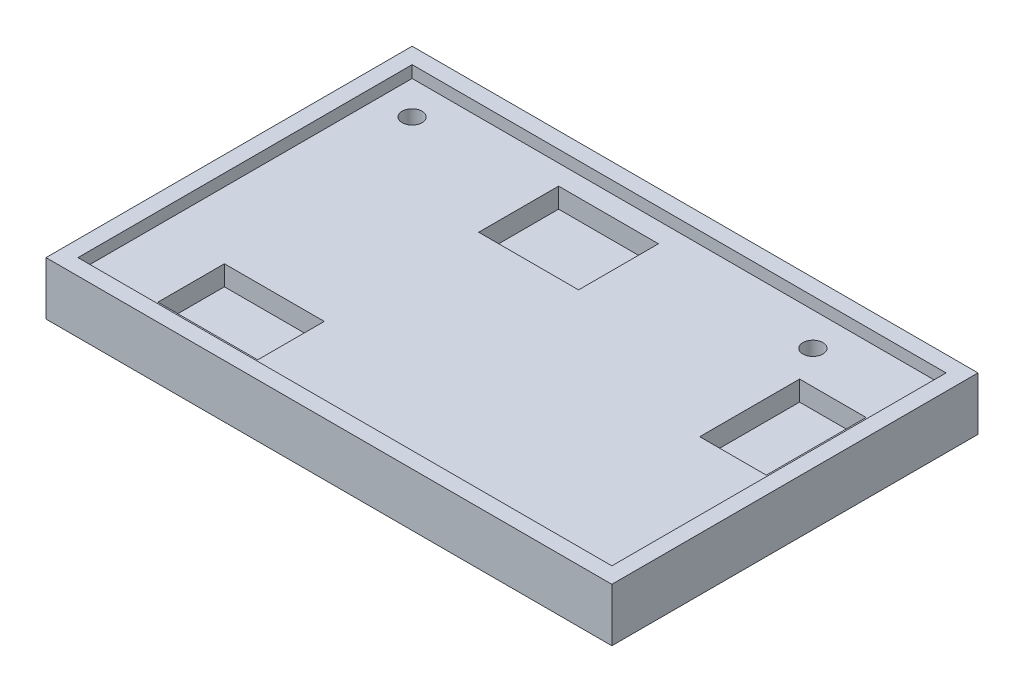
ISO-10303-21;
HEADER;
FILE_DESCRIPTION(('STEP AP214'),'2;1');
FILE_NAME('part.step','',(''),(''),'','','');
FILE_SCHEMA(('AUTOMOTIVE_DESIGN { 1 0 10303 214 1 1 1 1 }'));
ENDSEC;
DATA;
#1=APPLICATION_CONTEXT('core data for automotive mechanical design processes');
#2=APPLICATION_PROTOCOL_DEFINITION('international standard','automotive_design',2000,#1);
#3=PRODUCT_CONTEXT('',#1,'mechanical');
#4=PRODUCT('Part','Part','',(#3));
#5=PRODUCT_RELATED_PRODUCT_CATEGORY('part','',(#4));
#6=PRODUCT_DEFINITION_FORMATION('','',#4);
#7=PRODUCT_DEFINITION_CONTEXT('part definition',#1,'design');
#8=PRODUCT_DEFINITION('design','',#6,#7);
#9=PRODUCT_DEFINITION_SHAPE('','',#8);
#10=(LENGTH_UNIT() NAMED_UNIT(*) SI_UNIT(.MILLI.,.METRE.));
#11=(NAMED_UNIT(*) PLANE_ANGLE_UNIT() SI_UNIT($,.RADIAN.));
#12=(NAMED_UNIT(*) SI_UNIT($,.STERADIAN.) SOLID_ANGLE_UNIT());
#13=UNCERTAINTY_MEASURE_WITH_UNIT(LENGTH_MEASURE(1.E-05),#10,'distance_accuracy_value','');
#14=(GEOMETRIC_REPRESENTATION_CONTEXT(3) GLOBAL_UNCERTAINTY_ASSIGNED_CONTEXT((#13)) GLOBAL_UNIT_ASSIGNED_CONTEXT((#10,
#11,#12)) REPRESENTATION_CONTEXT('',''));
#15=CARTESIAN_POINT('',(0.,0.,0.));
#16=DIRECTION('',(0.,0.,1.));
#17=DIRECTION('',(1.,0.,0.));
#18=AXIS2_PLACEMENT_3D('',#15,#16,#17);
#19=CARTESIAN_POINT('',(0.,8.,-55.));
#20=DIRECTION('',(0.,0.,-1.));
#21=DIRECTION('',(-1.,0.,0.));
#22=AXIS2_PLACEMENT_3D('',#19,#20,#21);
#23=PLANE('',#22);
#24=DIRECTION('',(1.,0.,0.));
#25=VECTOR('',#24,1.);
#26=CARTESIAN_POINT('',(0.,0.,-55.));
#27=LINE('',#26,#25);
#28=CARTESIAN_POINT('',(0.,0.,-55.));
#29=VERTEX_POINT('',#28);
#30=CARTESIAN_POINT('',(85.,0.,-55.));
#31=VERTEX_POINT('',#30);
#32=EDGE_CURVE('E316',#29,#31,#27,.T.);
#33=ORIENTED_EDGE('',*,*,#32,.F.);
#34=DIRECTION('',(0.,-1.,0.));
#35=VECTOR('',#34,1.);
#36=CARTESIAN_POINT('',(0.,8.,-55.));
#37=LINE('',#36,#35);
#38=CARTESIAN_POINT('',(0.,8.,-55.));
#39=VERTEX_POINT('',#38);
#40=EDGE_CURVE('E11',#39,#29,#37,.T.);
#41=ORIENTED_EDGE('',*,*,#40,.F.);
#42=DIRECTION('',(1.,0.,0.));
#43=VECTOR('',#42,1.);
#44=CARTESIAN_POINT('',(0.,8.,-55.));
#45=LINE('',#44,#43);
#46=CARTESIAN_POINT('',(85.,8.,-55.));
#47=VERTEX_POINT('',#46);
#48=EDGE_CURVE('E323',#39,#47,#45,.T.);
#49=ORIENTED_EDGE('',*,*,#48,.T.);
#50=DIRECTION('',(0.,-1.,0.));
#51=VECTOR('',#50,1.);
#52=CARTESIAN_POINT('',(85.,8.,-55.));
#53=LINE('',#52,#51);
#54=EDGE_CURVE('E44',#47,#31,#53,.T.);
#55=ORIENTED_EDGE('',*,*,#54,.T.);
#56=EDGE_LOOP('',(#33,#41,#49,#55));
#57=FACE_BOUND('',#56,.T.);
#58=ADVANCED_FACE('F41',(#57),#23,.T.);
#59=CARTESIAN_POINT('',(0.,8.,0.));
#60=DIRECTION('',(-1.,0.,0.));
#61=DIRECTION('',(0.,0.,1.));
#62=AXIS2_PLACEMENT_3D('',#59,#60,#61);
#63=PLANE('',#62);
#64=DIRECTION('',(0.,0.,-1.));
#65=VECTOR('',#64,1.);
#66=CARTESIAN_POINT('',(0.,0.,0.));
#67=LINE('',#66,#65);
#68=CARTESIAN_POINT('',(0.,0.,0.));
#69=VERTEX_POINT('',#68);
#70=EDGE_CURVE('E327',#69,#29,#67,.T.);
#71=ORIENTED_EDGE('',*,*,#70,.F.);
#72=DIRECTION('',(0.,-1.,0.));
#73=VECTOR('',#72,1.);
#74=CARTESIAN_POINT('',(0.,8.,0.));
#75=LINE('',#74,#73);
#76=CARTESIAN_POINT('',(0.,8.,0.));
#77=VERTEX_POINT('',#76);
#78=EDGE_CURVE('E49',#77,#69,#75,.T.);
#79=ORIENTED_EDGE('',*,*,#78,.F.);
#80=DIRECTION('',(0.,0.,-1.));
#81=VECTOR('',#80,1.);
#82=CARTESIAN_POINT('',(0.,8.,0.));
#83=LINE('',#82,#81);
#84=EDGE_CURVE('E331',#77,#39,#83,.T.);
#85=ORIENTED_EDGE('',*,*,#84,.T.);
#86=ORIENTED_EDGE('',*,*,#40,.T.);
#87=EDGE_LOOP('',(#71,#79,#85,#86));
#88=FACE_BOUND('',#87,.T.);
#89=ADVANCED_FACE('F359',(#88),#63,.T.);
#90=CARTESIAN_POINT('',(0.,8.,0.));
#91=DIRECTION('',(0.,0.,-1.));
#92=DIRECTION('',(-1.,0.,0.));
#93=AXIS2_PLACEMENT_3D('',#90,#91,#92);
#94=PLANE('',#93);
#95=DIRECTION('',(1.,0.,0.));
#96=VECTOR('',#95,1.);
#97=CARTESIAN_POINT('',(0.,0.,0.));
#98=LINE('',#97,#96);
#99=CARTESIAN_POINT('',(85.,0.,0.));
#100=VERTEX_POINT('',#99);
#101=EDGE_CURVE('E339',#69,#100,#98,.T.);
#102=ORIENTED_EDGE('',*,*,#101,.T.);
#103=DIRECTION('',(0.,-1.,0.));
#104=VECTOR('',#103,1.);
#105=CARTESIAN_POINT('',(85.,8.,0.));
#106=LINE('',#105,#104);
#107=CARTESIAN_POINT('',(85.,8.,0.));
#108=VERTEX_POINT('',#107);
#109=EDGE_CURVE('E343',#108,#100,#106,.T.);
#110=ORIENTED_EDGE('',*,*,#109,.F.);
#111=DIRECTION('',(1.,0.,0.));
#112=VECTOR('',#111,1.);
#113=CARTESIAN_POINT('',(0.,8.,0.));
#114=LINE('',#113,#112);
#115=EDGE_CURVE('E329',#77,#108,#114,.T.);
#116=ORIENTED_EDGE('',*,*,#115,.F.);
#117=ORIENTED_EDGE('',*,*,#78,.T.);
#118=EDGE_LOOP('',(#102,#110,#116,#117));
#119=FACE_BOUND('',#118,.T.);
#120=ADVANCED_FACE('F365',(#119),#94,.F.);
#121=CARTESIAN_POINT('',(85.,8.,0.));
#122=DIRECTION('',(-1.,0.,0.));
#123=DIRECTION('',(0.,0.,1.));
#124=AXIS2_PLACEMENT_3D('',#121,#122,#123);
#125=PLANE('',#124);
#126=DIRECTION('',(0.,0.,-1.));
#127=VECTOR('',#126,1.);
#128=CARTESIAN_POINT('',(85.,0.,0.));
#129=LINE('',#128,#127);
#130=EDGE_CURVE('E336',#100,#31,#129,.T.);
#131=ORIENTED_EDGE('',*,*,#130,.T.);
#132=ORIENTED_EDGE('',*,*,#54,.F.);
#133=DIRECTION('',(0.,0.,-1.));
#134=VECTOR('',#133,1.);
#135=CARTESIAN_POINT('',(85.,8.,0.));
#136=LINE('',#135,#134);
#137=EDGE_CURVE('E326',#108,#47,#136,.T.);
#138=ORIENTED_EDGE('',*,*,#137,.F.);
#139=ORIENTED_EDGE('',*,*,#109,.T.);
#140=EDGE_LOOP('',(#131,#132,#138,#139));
#141=FACE_BOUND('',#140,.T.);
#142=ADVANCED_FACE('F353',(#141),#125,.F.);
#143=CARTESIAN_POINT('',(0.,8.,0.));
#144=DIRECTION('',(0.,1.,0.));
#145=DIRECTION('',(0.,0.,1.));
#146=AXIS2_PLACEMENT_3D('',#143,#144,#145);
#147=PLANE('',#146);
#148=DIRECTION('',(0.,0.,1.));
#149=VECTOR('',#148,1.);
#150=CARTESIAN_POINT('',(2.4,8.,-52.6));
#151=LINE('',#150,#149);
#152=CARTESIAN_POINT('',(2.4,8.,-52.6));
#153=VERTEX_POINT('',#152);
#154=CARTESIAN_POINT('',(2.4,8.,-2.4));
#155=VERTEX_POINT('',#154);
#156=EDGE_CURVE('E288',#153,#155,#151,.T.);
#157=ORIENTED_EDGE('',*,*,#156,.F.);
#158=DIRECTION('',(-1.,0.,0.));
#159=VECTOR('',#158,1.);
#160=CARTESIAN_POINT('',(82.6,8.,-52.6));
#161=LINE('',#160,#159);
#162=CARTESIAN_POINT('',(82.6,8.,-52.6));
#163=VERTEX_POINT('',#162);
#164=EDGE_CURVE('E295',#163,#153,#161,.T.);
#165=ORIENTED_EDGE('',*,*,#164,.F.);
#166=DIRECTION('',(0.,0.,-1.));
#167=VECTOR('',#166,1.);
#168=CARTESIAN_POINT('',(82.6,8.,-2.4));
#169=LINE('',#168,#167);
#170=CARTESIAN_POINT('',(82.6,8.,-2.4));
#171=VERTEX_POINT('',#170);
#172=EDGE_CURVE('E309',#171,#163,#169,.T.);
#173=ORIENTED_EDGE('',*,*,#172,.F.);
#174=DIRECTION('',(1.,0.,0.));
#175=VECTOR('',#174,1.);
#176=CARTESIAN_POINT('',(2.4,8.,-2.4));
#177=LINE('',#176,#175);
#178=EDGE_CURVE('E306',#155,#171,#177,.T.);
#179=ORIENTED_EDGE('',*,*,#178,.F.);
#180=EDGE_LOOP('',(#157,#165,#173,#179));
#181=FACE_BOUND('',#180,.T.);
#182=ORIENTED_EDGE('',*,*,#48,.F.);
#183=ORIENTED_EDGE('',*,*,#84,.F.);
#184=ORIENTED_EDGE('',*,*,#115,.T.);
#185=ORIENTED_EDGE('',*,*,#137,.T.);
#186=EDGE_LOOP('',(#182,#183,#184,#185));
#187=FACE_BOUND('',#186,.T.);
#188=ADVANCED_FACE('F363',(#181,#187),#147,.T.);
#189=CARTESIAN_POINT('',(0.,0.,0.));
#190=DIRECTION('',(0.,1.,0.));
#191=DIRECTION('',(0.,0.,1.));
#192=AXIS2_PLACEMENT_3D('',#189,#190,#191);
#193=PLANE('',#192);
#194=ORIENTED_EDGE('',*,*,#32,.T.);
#195=ORIENTED_EDGE('',*,*,#130,.F.);
#196=ORIENTED_EDGE('',*,*,#101,.F.);
#197=ORIENTED_EDGE('',*,*,#70,.T.);
#198=EDGE_LOOP('',(#194,#195,#196,#197));
#199=FACE_BOUND('',#198,.T.);
#200=ADVANCED_FACE('F356',(#199),#193,.F.);
#201=CARTESIAN_POINT('',(2.4,6.2,-52.6));
#202=DIRECTION('',(-1.,0.,0.));
#203=DIRECTION('',(0.,0.,1.));
#204=AXIS2_PLACEMENT_3D('',#201,#202,#203);
#205=PLANE('',#204);
#206=ORIENTED_EDGE('',*,*,#156,.T.);
#207=DIRECTION('',(0.,1.,0.));
#208=VECTOR('',#207,1.);
#209=CARTESIAN_POINT('',(2.4,6.2,-2.4));
#210=LINE('',#209,#208);
#211=CARTESIAN_POINT('',(2.4,6.2,-2.4));
#212=VERTEX_POINT('',#211);
#213=EDGE_CURVE('E304',#212,#155,#210,.T.);
#214=ORIENTED_EDGE('',*,*,#213,.F.);
#215=DIRECTION('',(0.,0.,1.));
#216=VECTOR('',#215,1.);
#217=CARTESIAN_POINT('',(2.4,6.2,-52.6));
#218=LINE('',#217,#216);
#219=CARTESIAN_POINT('',(2.4,6.2,-52.6));
#220=VERTEX_POINT('',#219);
#221=EDGE_CURVE('E291',#220,#212,#218,.T.);
#222=ORIENTED_EDGE('',*,*,#221,.F.);
#223=DIRECTION('',(0.,1.,0.));
#224=VECTOR('',#223,1.);
#225=CARTESIAN_POINT('',(2.4,6.2,-52.6));
#226=LINE('',#225,#224);
#227=EDGE_CURVE('E314',#220,#153,#226,.T.);
#228=ORIENTED_EDGE('',*,*,#227,.T.);
#229=EDGE_LOOP('',(#206,#214,#222,#228));
#230=FACE_BOUND('',#229,.T.);
#231=ADVANCED_FACE('F411',(#230),#205,.F.);
#232=CARTESIAN_POINT('',(82.6,6.2,-52.6));
#233=DIRECTION('',(0.,0.,-1.));
#234=DIRECTION('',(-1.,0.,0.));
#235=AXIS2_PLACEMENT_3D('',#232,#233,#234);
#236=PLANE('',#235);
#237=ORIENTED_EDGE('',*,*,#164,.T.);
#238=ORIENTED_EDGE('',*,*,#227,.F.);
#239=DIRECTION('',(-1.,0.,0.));
#240=VECTOR('',#239,1.);
#241=CARTESIAN_POINT('',(82.6,6.2,-52.6));
#242=LINE('',#241,#240);
#243=CARTESIAN_POINT('',(82.6,6.2,-52.6));
#244=VERTEX_POINT('',#243);
#245=EDGE_CURVE('E301',#244,#220,#242,.T.);
#246=ORIENTED_EDGE('',*,*,#245,.F.);
#247=DIRECTION('',(0.,1.,0.));
#248=VECTOR('',#247,1.);
#249=CARTESIAN_POINT('',(82.6,6.2,-52.6));
#250=LINE('',#249,#248);
#251=EDGE_CURVE('E317',#244,#163,#250,.T.);
#252=ORIENTED_EDGE('',*,*,#251,.T.);
#253=EDGE_LOOP('',(#237,#238,#246,#252));
#254=FACE_BOUND('',#253,.T.);
#255=ADVANCED_FACE('F419',(#254),#236,.F.);
#256=CARTESIAN_POINT('',(82.6,6.2,-2.4));
#257=DIRECTION('',(1.,0.,0.));
#258=DIRECTION('',(0.,0.,-1.));
#259=AXIS2_PLACEMENT_3D('',#256,#257,#258);
#260=PLANE('',#259);
#261=ORIENTED_EDGE('',*,*,#172,.T.);
#262=ORIENTED_EDGE('',*,*,#251,.F.);
#263=DIRECTION('',(0.,0.,-1.));
#264=VECTOR('',#263,1.);
#265=CARTESIAN_POINT('',(82.6,6.2,-2.4));
#266=LINE('',#265,#264);
#267=CARTESIAN_POINT('',(82.6,6.2,-2.4));
#268=VERTEX_POINT('',#267);
#269=EDGE_CURVE('E298',#268,#244,#266,.T.);
#270=ORIENTED_EDGE('',*,*,#269,.F.);
#271=DIRECTION('',(0.,1.,0.));
#272=VECTOR('',#271,1.);
#273=CARTESIAN_POINT('',(82.6,6.2,-2.4));
#274=LINE('',#273,#272);
#275=EDGE_CURVE('E319',#268,#171,#274,.T.);
#276=ORIENTED_EDGE('',*,*,#275,.T.);
#277=EDGE_LOOP('',(#261,#262,#270,#276));
#278=FACE_BOUND('',#277,.T.);
#279=ADVANCED_FACE('F429',(#278),#260,.F.);
#280=CARTESIAN_POINT('',(2.4,6.2,-2.4));
#281=DIRECTION('',(0.,0.,1.));
#282=DIRECTION('',(1.,0.,0.));
#283=AXIS2_PLACEMENT_3D('',#280,#281,#282);
#284=PLANE('',#283);
#285=ORIENTED_EDGE('',*,*,#178,.T.);
#286=ORIENTED_EDGE('',*,*,#275,.F.);
#287=DIRECTION('',(1.,0.,0.));
#288=VECTOR('',#287,1.);
#289=CARTESIAN_POINT('',(2.4,6.2,-2.4));
#290=LINE('',#289,#288);
#291=EDGE_CURVE('E294',#212,#268,#290,.T.);
#292=ORIENTED_EDGE('',*,*,#291,.F.);
#293=ORIENTED_EDGE('',*,*,#213,.T.);
#294=EDGE_LOOP('',(#285,#286,#292,#293));
#295=FACE_BOUND('',#294,.T.);
#296=ADVANCED_FACE('F439',(#295),#284,.F.);
#297=CARTESIAN_POINT('',(0.,6.2,0.));
#298=DIRECTION('',(0.,1.,0.));
#299=DIRECTION('',(0.,0.,1.));
#300=AXIS2_PLACEMENT_3D('',#297,#298,#299);
#301=PLANE('',#300);
#302=DIRECTION('',(0.,0.,1.));
#303=VECTOR('',#302,1.);
#304=CARTESIAN_POINT('',(12.4,6.2,-14.4));
#305=LINE('',#304,#303);
#306=CARTESIAN_POINT('',(12.4,6.2,-14.4));
#307=VERTEX_POINT('',#306);
#308=CARTESIAN_POINT('',(12.4,6.2,-4.4));
#309=VERTEX_POINT('',#308);
#310=EDGE_CURVE('E57',#307,#309,#305,.T.);
#311=ORIENTED_EDGE('',*,*,#310,.F.);
#312=DIRECTION('',(-1.,0.,0.));
#313=VECTOR('',#312,1.);
#314=CARTESIAN_POINT('',(12.4,6.2,-14.4));
#315=LINE('',#314,#313);
#316=CARTESIAN_POINT('',(27.4,6.2,-14.4));
#317=VERTEX_POINT('',#316);
#318=EDGE_CURVE('E198',#317,#307,#315,.T.);
#319=ORIENTED_EDGE('',*,*,#318,.F.);
#320=DIRECTION('',(0.,0.,-1.));
#321=VECTOR('',#320,1.);
#322=CARTESIAN_POINT('',(27.4,6.2,-14.4));
#323=LINE('',#322,#321);
#324=CARTESIAN_POINT('',(27.4,6.2,-4.4));
#325=VERTEX_POINT('',#324);
#326=EDGE_CURVE('E201',#325,#317,#323,.T.);
#327=ORIENTED_EDGE('',*,*,#326,.F.);
#328=DIRECTION('',(1.,0.,0.));
#329=VECTOR('',#328,1.);
#330=CARTESIAN_POINT('',(12.4,6.2,-4.4));
#331=LINE('',#330,#329);
#332=EDGE_CURVE('E207',#309,#325,#331,.T.);
#333=ORIENTED_EDGE('',*,*,#332,.F.);
#334=EDGE_LOOP('',(#311,#319,#327,#333));
#335=FACE_BOUND('',#334,.T.);
#336=DIRECTION('',(0.,0.,1.));
#337=VECTOR('',#336,1.);
#338=CARTESIAN_POINT('',(70.6,6.2,-42.6));
#339=LINE('',#338,#337);
#340=CARTESIAN_POINT('',(70.6,6.2,-42.6));
#341=VERTEX_POINT('',#340);
#342=CARTESIAN_POINT('',(70.6,6.2,-27.6));
#343=VERTEX_POINT('',#342);
#344=EDGE_CURVE('E65',#341,#343,#339,.T.);
#345=ORIENTED_EDGE('',*,*,#344,.F.);
#346=DIRECTION('',(-1.,0.,0.));
#347=VECTOR('',#346,1.);
#348=CARTESIAN_POINT('',(70.6,6.2,-42.6));
#349=LINE('',#348,#347);
#350=CARTESIAN_POINT('',(80.6,6.2,-42.6));
#351=VERTEX_POINT('',#350);
#352=EDGE_CURVE('E227',#351,#341,#349,.T.);
#353=ORIENTED_EDGE('',*,*,#352,.F.);
#354=DIRECTION('',(0.,0.,-1.));
#355=VECTOR('',#354,1.);
#356=CARTESIAN_POINT('',(80.6,6.2,-42.6));
#357=LINE('',#356,#355);
#358=CARTESIAN_POINT('',(80.6,6.2,-27.6));
#359=VERTEX_POINT('',#358);
#360=EDGE_CURVE('E230',#359,#351,#357,.T.);
#361=ORIENTED_EDGE('',*,*,#360,.F.);
#362=DIRECTION('',(1.,0.,0.));
#363=VECTOR('',#362,1.);
#364=CARTESIAN_POINT('',(70.6,6.2,-27.6));
#365=LINE('',#364,#363);
#366=EDGE_CURVE('E234',#343,#359,#365,.T.);
#367=ORIENTED_EDGE('',*,*,#366,.F.);
#368=EDGE_LOOP('',(#345,#353,#361,#367));
#369=FACE_BOUND('',#368,.T.);
#370=DIRECTION('',(0.,0.,1.));
#371=VECTOR('',#370,1.);
#372=CARTESIAN_POINT('',(27.4,6.2,-49.6));
#373=LINE('',#372,#371);
#374=CARTESIAN_POINT('',(27.4,6.2,-49.6));
#375=VERTEX_POINT('',#374);
#376=CARTESIAN_POINT('',(27.4,6.2,-37.6));
#377=VERTEX_POINT('',#376);
#378=EDGE_CURVE('E226',#375,#377,#373,.T.);
#379=ORIENTED_EDGE('',*,*,#378,.F.);
#380=DIRECTION('',(-1.,0.,0.));
#381=VECTOR('',#380,1.);
#382=CARTESIAN_POINT('',(27.4,6.2,-49.6));
#383=LINE('',#382,#381);
#384=CARTESIAN_POINT('',(42.4,6.2,-49.6));
#385=VERTEX_POINT('',#384);
#386=EDGE_CURVE('E258',#385,#375,#383,.T.);
#387=ORIENTED_EDGE('',*,*,#386,.F.);
#388=DIRECTION('',(0.,0.,-1.));
#389=VECTOR('',#388,1.);
#390=CARTESIAN_POINT('',(42.4,6.2,-49.6));
#391=LINE('',#390,#389);
#392=CARTESIAN_POINT('',(42.4,6.2,-37.6));
#393=VERTEX_POINT('',#392);
#394=EDGE_CURVE('E261',#393,#385,#391,.T.);
#395=ORIENTED_EDGE('',*,*,#394,.F.);
#396=DIRECTION('',(1.,0.,0.));
#397=VECTOR('',#396,1.);
#398=CARTESIAN_POINT('',(27.4,6.2,-37.6));
#399=LINE('',#398,#397);
#400=EDGE_CURVE('E265',#377,#393,#399,.T.);
#401=ORIENTED_EDGE('',*,*,#400,.F.);
#402=EDGE_LOOP('',(#379,#387,#395,#401));
#403=FACE_BOUND('',#402,.T.);
#404=CARTESIAN_POINT('',(67.6,6.2,-47.6));
#405=DIRECTION('',(0.,1.,0.));
#406=DIRECTION('',(0.,0.,-1.));
#407=AXIS2_PLACEMENT_3D('',#404,#405,#406);
#408=CIRCLE('',#407,1.50000000000001);
#409=CARTESIAN_POINT('',(67.6,6.2,-49.1));
#410=VERTEX_POINT('',#409);
#411=EDGE_CURVE('E279',#410,#410,#408,.T.);
#412=ORIENTED_EDGE('',*,*,#411,.F.);
#413=EDGE_LOOP('',(#412));
#414=FACE_BOUND('',#413,.T.);
#415=CARTESIAN_POINT('',(7.4,6.2,-47.6));
#416=DIRECTION('',(0.,1.,0.));
#417=DIRECTION('',(0.,0.,1.));
#418=AXIS2_PLACEMENT_3D('',#415,#416,#417);
#419=CIRCLE('',#418,1.5);
#420=CARTESIAN_POINT('',(7.4,6.2,-46.1));
#421=VERTEX_POINT('',#420);
#422=EDGE_CURVE('E282',#421,#421,#419,.T.);
#423=ORIENTED_EDGE('',*,*,#422,.F.);
#424=EDGE_LOOP('',(#423));
#425=FACE_BOUND('',#424,.T.);
#426=ORIENTED_EDGE('',*,*,#221,.T.);
#427=ORIENTED_EDGE('',*,*,#291,.T.);
#428=ORIENTED_EDGE('',*,*,#269,.T.);
#429=ORIENTED_EDGE('',*,*,#245,.T.);
#430=EDGE_LOOP('',(#426,#427,#428,#429));
#431=FACE_BOUND('',#430,.T.);
#432=ADVANCED_FACE('F449',(#335,#369,#403,#414,#425,#431),#301,.T.);
#433=CARTESIAN_POINT('',(7.4,4.,-47.6));
#434=DIRECTION('',(0.,1.,0.));
#435=DIRECTION('',(0.,0.,1.));
#436=AXIS2_PLACEMENT_3D('',#433,#434,#435);
#437=CYLINDRICAL_SURFACE('',#436,1.5);
#438=CARTESIAN_POINT('',(7.4,4.,-47.6));
#439=DIRECTION('',(0.,1.,0.));
#440=DIRECTION('',(0.,0.,1.));
#441=AXIS2_PLACEMENT_3D('',#438,#439,#440);
#442=CIRCLE('',#441,1.5);
#443=CARTESIAN_POINT('',(7.4,4.,-46.1));
#444=VERTEX_POINT('',#443);
#445=EDGE_CURVE('E285',#444,#444,#442,.T.);
#446=ORIENTED_EDGE('',*,*,#445,.F.);
#447=EDGE_LOOP('',(#446));
#448=FACE_BOUND('',#447,.T.);
#449=ORIENTED_EDGE('',*,*,#422,.T.);
#450=EDGE_LOOP('',(#449));
#451=FACE_BOUND('',#450,.T.);
#452=ADVANCED_FACE('F460',(#448,#451),#437,.F.);
#453=CARTESIAN_POINT('',(7.4,4.,-47.6));
#454=DIRECTION('',(0.,1.,0.));
#455=DIRECTION('',(0.,0.,1.));
#456=AXIS2_PLACEMENT_3D('',#453,#454,#455);
#457=PLANE('',#456);
#458=ORIENTED_EDGE('',*,*,#445,.T.);
#459=EDGE_LOOP('',(#458));
#460=FACE_BOUND('',#459,.T.);
#461=ADVANCED_FACE('F471',(#460),#457,.T.);
#462=CARTESIAN_POINT('',(67.6,4.,-47.6));
#463=DIRECTION('',(0.,1.,0.));
#464=DIRECTION('',(0.,0.,1.));
#465=AXIS2_PLACEMENT_3D('',#462,#463,#464);
#466=CYLINDRICAL_SURFACE('',#465,1.50000000000001);
#467=CARTESIAN_POINT('',(67.6,4.,-47.6));
#468=DIRECTION('',(0.,1.,0.));
#469=DIRECTION('',(0.,0.,-1.));
#470=AXIS2_PLACEMENT_3D('',#467,#468,#469);
#471=CIRCLE('',#470,1.50000000000001);
#472=CARTESIAN_POINT('',(67.6,4.,-49.1));
#473=VERTEX_POINT('',#472);
#474=EDGE_CURVE('E213',#473,#473,#471,.T.);
#475=ORIENTED_EDGE('',*,*,#474,.F.);
#476=EDGE_LOOP('',(#475));
#477=FACE_BOUND('',#476,.T.);
#478=ORIENTED_EDGE('',*,*,#411,.T.);
#479=EDGE_LOOP('',(#478));
#480=FACE_BOUND('',#479,.T.);
#481=ADVANCED_FACE('F481',(#477,#480),#466,.F.);
#482=CARTESIAN_POINT('',(67.6,4.,-47.6));
#483=DIRECTION('',(0.,-1.,0.));
#484=DIRECTION('',(0.,0.,-1.));
#485=AXIS2_PLACEMENT_3D('',#482,#483,#484);
#486=PLANE('',#485);
#487=ORIENTED_EDGE('',*,*,#474,.T.);
#488=EDGE_LOOP('',(#487));
#489=FACE_BOUND('',#488,.T.);
#490=ADVANCED_FACE('F491',(#489),#486,.F.);
#491=CARTESIAN_POINT('',(27.4,3.2,-49.6));
#492=DIRECTION('',(-1.,0.,0.));
#493=DIRECTION('',(0.,0.,1.));
#494=AXIS2_PLACEMENT_3D('',#491,#492,#493);
#495=PLANE('',#494);
#496=ORIENTED_EDGE('',*,*,#378,.T.);
#497=DIRECTION('',(0.,1.,0.));
#498=VECTOR('',#497,1.);
#499=CARTESIAN_POINT('',(27.4,3.2,-37.6));
#500=LINE('',#499,#498);
#501=CARTESIAN_POINT('',(27.4,3.2,-37.6));
#502=VERTEX_POINT('',#501);
#503=EDGE_CURVE('E248',#502,#377,#500,.T.);
#504=ORIENTED_EDGE('',*,*,#503,.F.);
#505=DIRECTION('',(0.,0.,1.));
#506=VECTOR('',#505,1.);
#507=CARTESIAN_POINT('',(27.4,3.2,-49.6));
#508=LINE('',#507,#506);
#509=CARTESIAN_POINT('',(27.4,3.2,-49.6));
#510=VERTEX_POINT('',#509);
#511=EDGE_CURVE('E262',#510,#502,#508,.T.);
#512=ORIENTED_EDGE('',*,*,#511,.F.);
#513=DIRECTION('',(0.,1.,0.));
#514=VECTOR('',#513,1.);
#515=CARTESIAN_POINT('',(27.4,3.2,-49.6));
#516=LINE('',#515,#514);
#517=EDGE_CURVE('E256',#510,#375,#516,.T.);
#518=ORIENTED_EDGE('',*,*,#517,.T.);
#519=EDGE_LOOP('',(#496,#504,#512,#518));
#520=FACE_BOUND('',#519,.T.);
#521=ADVANCED_FACE('F500',(#520),#495,.F.);
#522=CARTESIAN_POINT('',(27.4,3.2,-49.6));
#523=DIRECTION('',(0.,0.,-1.));
#524=DIRECTION('',(-1.,0.,0.));
#525=AXIS2_PLACEMENT_3D('',#522,#523,#524);
#526=PLANE('',#525);
#527=ORIENTED_EDGE('',*,*,#386,.T.);
#528=ORIENTED_EDGE('',*,*,#517,.F.);
#529=DIRECTION('',(-1.,0.,0.));
#530=VECTOR('',#529,1.);
#531=CARTESIAN_POINT('',(27.4,3.2,-49.6));
#532=LINE('',#531,#530);
#533=CARTESIAN_POINT('',(42.4,3.2,-49.6));
#534=VERTEX_POINT('',#533);
#535=EDGE_CURVE('E251',#534,#510,#532,.T.);
#536=ORIENTED_EDGE('',*,*,#535,.F.);
#537=DIRECTION('',(0.,1.,0.));
#538=VECTOR('',#537,1.);
#539=CARTESIAN_POINT('',(42.4,3.2,-49.6));
#540=LINE('',#539,#538);
#541=EDGE_CURVE('E254',#534,#385,#540,.T.);
#542=ORIENTED_EDGE('',*,*,#541,.T.);
#543=EDGE_LOOP('',(#527,#528,#536,#542));
#544=FACE_BOUND('',#543,.T.);
#545=ADVANCED_FACE('F509',(#544),#526,.F.);
#546=CARTESIAN_POINT('',(42.4,3.2,-49.6));
#547=DIRECTION('',(1.,0.,0.));
#548=DIRECTION('',(0.,0.,-1.));
#549=AXIS2_PLACEMENT_3D('',#546,#547,#548);
#550=PLANE('',#549);
#551=ORIENTED_EDGE('',*,*,#394,.T.);
#552=ORIENTED_EDGE('',*,*,#541,.F.);
#553=DIRECTION('',(0.,0.,-1.));
#554=VECTOR('',#553,1.);
#555=CARTESIAN_POINT('',(42.4,3.2,-49.6));
#556=LINE('',#555,#554);
#557=CARTESIAN_POINT('',(42.4,3.2,-37.6));
#558=VERTEX_POINT('',#557);
#559=EDGE_CURVE('E271',#558,#534,#556,.T.);
#560=ORIENTED_EDGE('',*,*,#559,.F.);
#561=DIRECTION('',(0.,1.,0.));
#562=VECTOR('',#561,1.);
#563=CARTESIAN_POINT('',(42.4,3.2,-37.6));
#564=LINE('',#563,#562);
#565=EDGE_CURVE('E252',#558,#393,#564,.T.);
#566=ORIENTED_EDGE('',*,*,#565,.T.);
#567=EDGE_LOOP('',(#551,#552,#560,#566));
#568=FACE_BOUND('',#567,.T.);
#569=ADVANCED_FACE('F519',(#568),#550,.F.);
#570=CARTESIAN_POINT('',(27.4,3.2,-37.6));
#571=DIRECTION('',(0.,0.,1.));
#572=DIRECTION('',(1.,0.,0.));
#573=AXIS2_PLACEMENT_3D('',#570,#571,#572);
#574=PLANE('',#573);
#575=ORIENTED_EDGE('',*,*,#400,.T.);
#576=ORIENTED_EDGE('',*,*,#565,.F.);
#577=DIRECTION('',(1.,0.,0.));
#578=VECTOR('',#577,1.);
#579=CARTESIAN_POINT('',(27.4,3.2,-37.6));
#580=LINE('',#579,#578);
#581=EDGE_CURVE('E274',#502,#558,#580,.T.);
#582=ORIENTED_EDGE('',*,*,#581,.F.);
#583=ORIENTED_EDGE('',*,*,#503,.T.);
#584=EDGE_LOOP('',(#575,#576,#582,#583));
#585=FACE_BOUND('',#584,.T.);
#586=ADVANCED_FACE('F529',(#585),#574,.F.);
#587=CARTESIAN_POINT('',(0.,3.2,0.));
#588=DIRECTION('',(0.,1.,0.));
#589=DIRECTION('',(0.,0.,1.));
#590=AXIS2_PLACEMENT_3D('',#587,#588,#589);
#591=PLANE('',#590);
#592=ORIENTED_EDGE('',*,*,#511,.T.);
#593=ORIENTED_EDGE('',*,*,#581,.T.);
#594=ORIENTED_EDGE('',*,*,#559,.T.);
#595=ORIENTED_EDGE('',*,*,#535,.T.);
#596=EDGE_LOOP('',(#592,#593,#594,#595));
#597=FACE_BOUND('',#596,.T.);
#598=ADVANCED_FACE('F539',(#597),#591,.T.);
#599=CARTESIAN_POINT('',(70.6,3.2,-42.6));
#600=DIRECTION('',(-1.,0.,0.));
#601=DIRECTION('',(0.,0.,1.));
#602=AXIS2_PLACEMENT_3D('',#599,#600,#601);
#603=PLANE('',#602);
#604=ORIENTED_EDGE('',*,*,#344,.T.);
#605=DIRECTION('',(0.,1.,0.));
#606=VECTOR('',#605,1.);
#607=CARTESIAN_POINT('',(70.6,3.2,-27.6));
#608=LINE('',#607,#606);
#609=CARTESIAN_POINT('',(70.6,3.2,-27.6));
#610=VERTEX_POINT('',#609);
#611=EDGE_CURVE('E217',#610,#343,#608,.T.);
#612=ORIENTED_EDGE('',*,*,#611,.F.);
#613=DIRECTION('',(0.,0.,1.));
#614=VECTOR('',#613,1.);
#615=CARTESIAN_POINT('',(70.6,3.2,-42.6));
#616=LINE('',#615,#614);
#617=CARTESIAN_POINT('',(70.6,3.2,-42.6));
#618=VERTEX_POINT('',#617);
#619=EDGE_CURVE('E231',#618,#610,#616,.T.);
#620=ORIENTED_EDGE('',*,*,#619,.F.);
#621=DIRECTION('',(0.,1.,0.));
#622=VECTOR('',#621,1.);
#623=CARTESIAN_POINT('',(70.6,3.2,-42.6));
#624=LINE('',#623,#622);
#625=EDGE_CURVE('E224',#618,#341,#624,.T.);
#626=ORIENTED_EDGE('',*,*,#625,.T.);
#627=EDGE_LOOP('',(#604,#612,#620,#626));
#628=FACE_BOUND('',#627,.T.);
#629=ADVANCED_FACE('F549',(#628),#603,.F.);
#630=CARTESIAN_POINT('',(70.6,3.2,-42.6));
#631=DIRECTION('',(0.,0.,-1.));
#632=DIRECTION('',(-1.,0.,0.));
#633=AXIS2_PLACEMENT_3D('',#630,#631,#632);
#634=PLANE('',#633);
#635=ORIENTED_EDGE('',*,*,#352,.T.);
#636=ORIENTED_EDGE('',*,*,#625,.F.);
#637=DIRECTION('',(-1.,0.,0.));
#638=VECTOR('',#637,1.);
#639=CARTESIAN_POINT('',(70.6,3.2,-42.6));
#640=LINE('',#639,#638);
#641=CARTESIAN_POINT('',(80.6,3.2,-42.6));
#642=VERTEX_POINT('',#641);
#643=EDGE_CURVE('E219',#642,#618,#640,.T.);
#644=ORIENTED_EDGE('',*,*,#643,.F.);
#645=DIRECTION('',(0.,1.,0.));
#646=VECTOR('',#645,1.);
#647=CARTESIAN_POINT('',(80.6,3.2,-42.6));
#648=LINE('',#647,#646);
#649=EDGE_CURVE('E222',#642,#351,#648,.T.);
#650=ORIENTED_EDGE('',*,*,#649,.T.);
#651=EDGE_LOOP('',(#635,#636,#644,#650));
#652=FACE_BOUND('',#651,.T.);
#653=ADVANCED_FACE('F559',(#652),#634,.F.);
#654=CARTESIAN_POINT('',(80.6,3.2,-42.6));
#655=DIRECTION('',(1.,0.,0.));
#656=DIRECTION('',(0.,0.,-1.));
#657=AXIS2_PLACEMENT_3D('',#654,#655,#656);
#658=PLANE('',#657);
#659=ORIENTED_EDGE('',*,*,#360,.T.);
#660=ORIENTED_EDGE('',*,*,#649,.F.);
#661=DIRECTION('',(0.,0.,-1.));
#662=VECTOR('',#661,1.);
#663=CARTESIAN_POINT('',(80.6,3.2,-42.6));
#664=LINE('',#663,#662);
#665=CARTESIAN_POINT('',(80.6,3.2,-27.6));
#666=VERTEX_POINT('',#665);
#667=EDGE_CURVE('E240',#666,#642,#664,.T.);
#668=ORIENTED_EDGE('',*,*,#667,.F.);
#669=DIRECTION('',(0.,1.,0.));
#670=VECTOR('',#669,1.);
#671=CARTESIAN_POINT('',(80.6,3.2,-27.6));
#672=LINE('',#671,#670);
#673=EDGE_CURVE('E220',#666,#359,#672,.T.);
#674=ORIENTED_EDGE('',*,*,#673,.T.);
#675=EDGE_LOOP('',(#659,#660,#668,#674));
#676=FACE_BOUND('',#675,.T.);
#677=ADVANCED_FACE('F568',(#676),#658,.F.);
#678=CARTESIAN_POINT('',(70.6,3.2,-27.6));
#679=DIRECTION('',(0.,0.,1.));
#680=DIRECTION('',(1.,0.,0.));
#681=AXIS2_PLACEMENT_3D('',#678,#679,#680);
#682=PLANE('',#681);
#683=ORIENTED_EDGE('',*,*,#366,.T.);
#684=ORIENTED_EDGE('',*,*,#673,.F.);
#685=DIRECTION('',(1.,0.,0.));
#686=VECTOR('',#685,1.);
#687=CARTESIAN_POINT('',(70.6,3.2,-27.6));
#688=LINE('',#687,#686);
#689=EDGE_CURVE('E243',#610,#666,#688,.T.);
#690=ORIENTED_EDGE('',*,*,#689,.F.);
#691=ORIENTED_EDGE('',*,*,#611,.T.);
#692=EDGE_LOOP('',(#683,#684,#690,#691));
#693=FACE_BOUND('',#692,.T.);
#694=ADVANCED_FACE('F578',(#693),#682,.F.);
#695=CARTESIAN_POINT('',(0.,3.2,0.));
#696=DIRECTION('',(0.,1.,0.));
#697=DIRECTION('',(0.,0.,1.));
#698=AXIS2_PLACEMENT_3D('',#695,#696,#697);
#699=PLANE('',#698);
#700=ORIENTED_EDGE('',*,*,#619,.T.);
#701=ORIENTED_EDGE('',*,*,#689,.T.);
#702=ORIENTED_EDGE('',*,*,#667,.T.);
#703=ORIENTED_EDGE('',*,*,#643,.T.);
#704=EDGE_LOOP('',(#700,#701,#702,#703));
#705=FACE_BOUND('',#704,.T.);
#706=ADVANCED_FACE('F588',(#705),#699,.T.);
#707=CARTESIAN_POINT('',(12.4,3.2,-14.4));
#708=DIRECTION('',(-1.,0.,0.));
#709=DIRECTION('',(0.,0.,1.));
#710=AXIS2_PLACEMENT_3D('',#707,#708,#709);
#711=PLANE('',#710);
#712=ORIENTED_EDGE('',*,*,#310,.T.);
#713=DIRECTION('',(0.,1.,0.));
#714=VECTOR('',#713,1.);
#715=CARTESIAN_POINT('',(12.4,3.2,-4.4));
#716=LINE('',#715,#714);
#717=CARTESIAN_POINT('',(12.4,3.2,-4.4));
#718=VERTEX_POINT('',#717);
#719=EDGE_CURVE('E176',#718,#309,#716,.T.);
#720=ORIENTED_EDGE('',*,*,#719,.F.);
#721=DIRECTION('',(0.,0.,1.));
#722=VECTOR('',#721,1.);
#723=CARTESIAN_POINT('',(12.4,3.2,-14.4));
#724=LINE('',#723,#722);
#725=CARTESIAN_POINT('',(12.4,3.2,-14.4));
#726=VERTEX_POINT('',#725);
#727=EDGE_CURVE('E180',#726,#718,#724,.T.);
#728=ORIENTED_EDGE('',*,*,#727,.F.);
#729=DIRECTION('',(0.,1.,0.));
#730=VECTOR('',#729,1.);
#731=CARTESIAN_POINT('',(12.4,3.2,-14.4));
#732=LINE('',#731,#730);
#733=EDGE_CURVE('E211',#726,#307,#732,.T.);
#734=ORIENTED_EDGE('',*,*,#733,.T.);
#735=EDGE_LOOP('',(#712,#720,#728,#734));
#736=FACE_BOUND('',#735,.T.);
#737=ADVANCED_FACE('F178',(#736),#711,.F.);
#738=CARTESIAN_POINT('',(12.4,3.2,-14.4));
#739=DIRECTION('',(0.,0.,-1.));
#740=DIRECTION('',(-1.,0.,0.));
#741=AXIS2_PLACEMENT_3D('',#738,#739,#740);
#742=PLANE('',#741);
#743=ORIENTED_EDGE('',*,*,#318,.T.);
#744=ORIENTED_EDGE('',*,*,#733,.F.);
#745=DIRECTION('',(-1.,0.,0.));
#746=VECTOR('',#745,1.);
#747=CARTESIAN_POINT('',(12.4,3.2,-14.4));
#748=LINE('',#747,#746);
#749=CARTESIAN_POINT('',(27.4,3.2,-14.4));
#750=VERTEX_POINT('',#749);
#751=EDGE_CURVE('E186',#750,#726,#748,.T.);
#752=ORIENTED_EDGE('',*,*,#751,.F.);
#753=DIRECTION('',(0.,1.,0.));
#754=VECTOR('',#753,1.);
#755=CARTESIAN_POINT('',(27.4,3.2,-14.4));
#756=LINE('',#755,#754);
#757=EDGE_CURVE('E214',#750,#317,#756,.T.);
#758=ORIENTED_EDGE('',*,*,#757,.T.);
#759=EDGE_LOOP('',(#743,#744,#752,#758));
#760=FACE_BOUND('',#759,.T.);
#761=ADVANCED_FACE('F607',(#760),#742,.F.);
#762=CARTESIAN_POINT('',(27.4,3.2,-14.4));
#763=DIRECTION('',(1.,0.,0.));
#764=DIRECTION('',(0.,0.,-1.));
#765=AXIS2_PLACEMENT_3D('',#762,#763,#764);
#766=PLANE('',#765);
#767=ORIENTED_EDGE('',*,*,#326,.T.);
#768=ORIENTED_EDGE('',*,*,#757,.F.);
#769=DIRECTION('',(0.,0.,-1.));
#770=VECTOR('',#769,1.);
#771=CARTESIAN_POINT('',(27.4,3.2,-14.4));
#772=LINE('',#771,#770);
#773=CARTESIAN_POINT('',(27.4,3.2,-4.4));
#774=VERTEX_POINT('',#773);
#775=EDGE_CURVE('E194',#774,#750,#772,.T.);
#776=ORIENTED_EDGE('',*,*,#775,.F.);
#777=DIRECTION('',(0.,1.,0.));
#778=VECTOR('',#777,1.);
#779=CARTESIAN_POINT('',(27.4,3.2,-4.4));
#780=LINE('',#779,#778);
#781=EDGE_CURVE('E185',#774,#325,#780,.T.);
#782=ORIENTED_EDGE('',*,*,#781,.T.);
#783=EDGE_LOOP('',(#767,#768,#776,#782));
#784=FACE_BOUND('',#783,.T.);
#785=ADVANCED_FACE('F616',(#784),#766,.F.);
#786=CARTESIAN_POINT('',(12.4,3.2,-4.4));
#787=DIRECTION('',(0.,0.,1.));
#788=DIRECTION('',(1.,0.,0.));
#789=AXIS2_PLACEMENT_3D('',#786,#787,#788);
#790=PLANE('',#789);
#791=ORIENTED_EDGE('',*,*,#332,.T.);
#792=ORIENTED_EDGE('',*,*,#781,.F.);
#793=DIRECTION('',(1.,0.,0.));
#794=VECTOR('',#793,1.);
#795=CARTESIAN_POINT('',(12.4,3.2,-4.4));
#796=LINE('',#795,#794);
#797=EDGE_CURVE('E189',#718,#774,#796,.T.);
#798=ORIENTED_EDGE('',*,*,#797,.F.);
#799=ORIENTED_EDGE('',*,*,#719,.T.);
#800=EDGE_LOOP('',(#791,#792,#798,#799));
#801=FACE_BOUND('',#800,.T.);
#802=ADVANCED_FACE('F190',(#801),#790,.F.);
#803=CARTESIAN_POINT('',(0.,3.2,0.));
#804=DIRECTION('',(0.,1.,0.));
#805=DIRECTION('',(0.,0.,1.));
#806=AXIS2_PLACEMENT_3D('',#803,#804,#805);
#807=PLANE('',#806);
#808=ORIENTED_EDGE('',*,*,#727,.T.);
#809=ORIENTED_EDGE('',*,*,#797,.T.);
#810=ORIENTED_EDGE('',*,*,#775,.T.);
#811=ORIENTED_EDGE('',*,*,#751,.T.);
#812=EDGE_LOOP('',(#808,#809,#810,#811));
#813=FACE_BOUND('',#812,.T.);
#814=ADVANCED_FACE('F196',(#813),#807,.T.);
#815=CLOSED_SHELL('',(#58,#89,#120,#142,#188,#200,#231,#255,#279,#296,#432,#452,#461,#481,#490,
#521,#545,#569,#586,#598,#629,#653,#677,#694,#706,#737,#761,#785,#802,#814));
#816=MANIFOLD_SOLID_BREP('B2',#815);
#817=ADVANCED_BREP_SHAPE_REPRESENTATION('',(#18,#816),#14);
#818=SHAPE_DEFINITION_REPRESENTATION(#9,#817);
ENDSEC;
END-ISO-10303-21;
